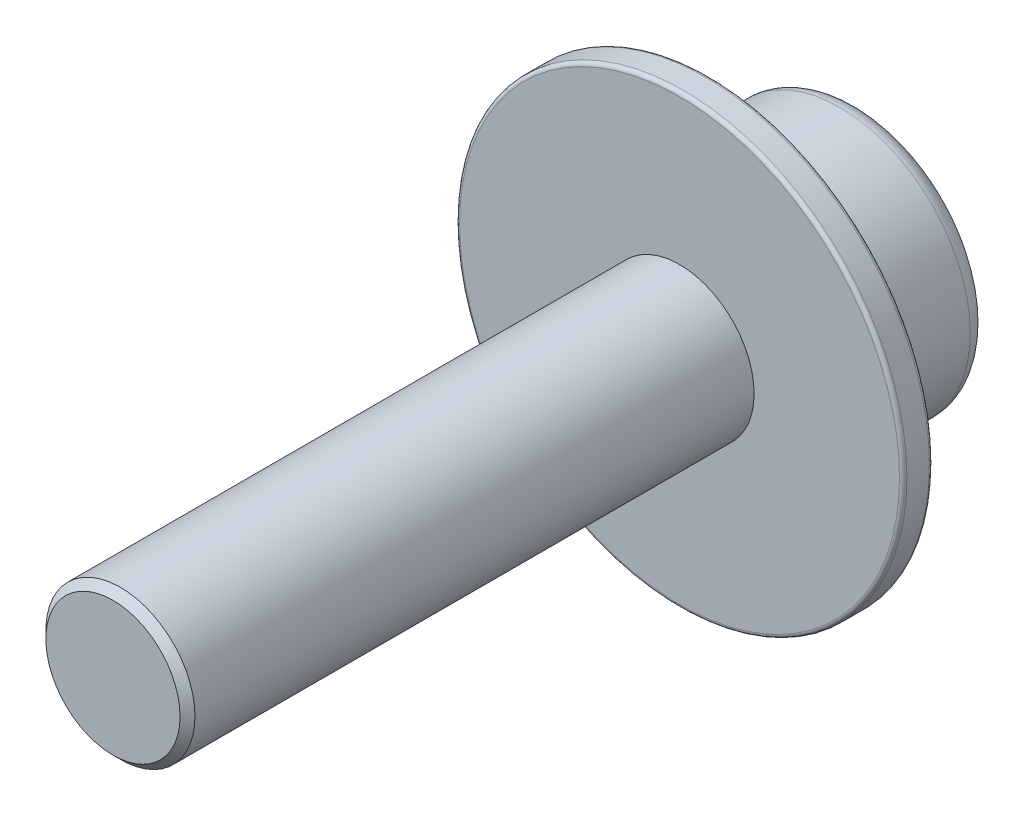
ISO-10303-21;
HEADER;
FILE_DESCRIPTION(('STEP AP214'),'2;1');
FILE_NAME('part.step','',(''),(''),'','','');
FILE_SCHEMA(('AUTOMOTIVE_DESIGN { 1 0 10303 214 1 1 1 1 }'));
ENDSEC;
DATA;
#1=APPLICATION_CONTEXT('core data for automotive mechanical design processes');
#2=APPLICATION_PROTOCOL_DEFINITION('international standard','automotive_design',2000,#1);
#3=PRODUCT_CONTEXT('',#1,'mechanical');
#4=PRODUCT('Part','Part','',(#3));
#5=PRODUCT_RELATED_PRODUCT_CATEGORY('part','',(#4));
#6=PRODUCT_DEFINITION_FORMATION('','',#4);
#7=PRODUCT_DEFINITION_CONTEXT('part definition',#1,'design');
#8=PRODUCT_DEFINITION('design','',#6,#7);
#9=PRODUCT_DEFINITION_SHAPE('','',#8);
#10=(LENGTH_UNIT() NAMED_UNIT(*) SI_UNIT(.MILLI.,.METRE.));
#11=(NAMED_UNIT(*) PLANE_ANGLE_UNIT() SI_UNIT($,.RADIAN.));
#12=(NAMED_UNIT(*) SI_UNIT($,.STERADIAN.) SOLID_ANGLE_UNIT());
#13=UNCERTAINTY_MEASURE_WITH_UNIT(LENGTH_MEASURE(1.E-05),#10,'distance_accuracy_value','');
#14=(GEOMETRIC_REPRESENTATION_CONTEXT(3) GLOBAL_UNCERTAINTY_ASSIGNED_CONTEXT((#13)) GLOBAL_UNIT_ASSIGNED_CONTEXT((#10,
#11,#12)) REPRESENTATION_CONTEXT('',''));
#15=CARTESIAN_POINT('',(0.,0.,0.));
#16=DIRECTION('',(0.,0.,1.));
#17=DIRECTION('',(1.,0.,0.));
#18=AXIS2_PLACEMENT_3D('',#15,#16,#17);
#19=CARTESIAN_POINT('',(0.,0.,4.));
#20=DIRECTION('',(0.,0.,-1.));
#21=DIRECTION('',(-1.,0.,0.));
#22=AXIS2_PLACEMENT_3D('',#19,#20,#21);
#23=CYLINDRICAL_SURFACE('',#22,3.5);
#24=CARTESIAN_POINT('',(0.,0.,3.5));
#25=DIRECTION('',(0.,0.,1.));
#26=DIRECTION('',(1.,0.,0.));
#27=AXIS2_PLACEMENT_3D('',#24,#25,#26);
#28=CIRCLE('',#27,3.5);
#29=CARTESIAN_POINT('',(3.5,0.,3.5));
#30=VERTEX_POINT('',#29);
#31=EDGE_CURVE('E180',#30,#30,#28,.F.);
#32=ORIENTED_EDGE('',*,*,#31,.T.);
#33=EDGE_LOOP('',(#32));
#34=FACE_BOUND('',#33,.T.);
#35=CARTESIAN_POINT('',(0.,0.,0.5));
#36=DIRECTION('',(0.,0.,1.));
#37=DIRECTION('',(1.,0.,0.));
#38=AXIS2_PLACEMENT_3D('',#35,#36,#37);
#39=CIRCLE('',#38,3.5);
#40=CARTESIAN_POINT('',(3.5,0.,0.5));
#41=VERTEX_POINT('',#40);
#42=EDGE_CURVE('E176',#41,#41,#39,.T.);
#43=ORIENTED_EDGE('',*,*,#42,.T.);
#44=EDGE_LOOP('',(#43));
#45=FACE_BOUND('',#44,.T.);
#46=ADVANCED_FACE('F41',(#34,#45),#23,.T.);
#47=CARTESIAN_POINT('',(0.,0.,0.));
#48=DIRECTION('',(0.,0.,1.));
#49=DIRECTION('',(1.,0.,0.));
#50=AXIS2_PLACEMENT_3D('',#47,#48,#49);
#51=PLANE('',#50);
#52=CARTESIAN_POINT('',(0.,0.,0.));
#53=DIRECTION('',(0.,0.,1.));
#54=DIRECTION('',(1.,0.,0.));
#55=AXIS2_PLACEMENT_3D('',#52,#53,#54);
#56=CIRCLE('',#55,3.);
#57=CARTESIAN_POINT('',(3.,0.,0.));
#58=VERTEX_POINT('',#57);
#59=EDGE_CURVE('E203',#58,#58,#56,.F.);
#60=ORIENTED_EDGE('',*,*,#59,.T.);
#61=EDGE_LOOP('',(#60));
#62=FACE_BOUND('',#61,.T.);
#63=DIRECTION('',(0.5,-0.866025403784439,0.));
#64=VECTOR('',#63,1.);
#65=CARTESIAN_POINT('',(1.94855715851499,1.125,0.));
#66=LINE('',#65,#64);
#67=CARTESIAN_POINT('',(2.59807621135332,0.,0.));
#68=VERTEX_POINT('',#67);
#69=CARTESIAN_POINT('',(1.29903810567666,2.25,0.));
#70=VERTEX_POINT('',#69);
#71=EDGE_CURVE('E196',#68,#70,#66,.F.);
#72=ORIENTED_EDGE('',*,*,#71,.T.);
#73=DIRECTION('',(1.,0.,0.));
#74=VECTOR('',#73,1.);
#75=CARTESIAN_POINT('',(0.,2.25,0.));
#76=LINE('',#75,#74);
#77=CARTESIAN_POINT('',(-1.29903810567666,2.25,0.));
#78=VERTEX_POINT('',#77);
#79=EDGE_CURVE('E199',#70,#78,#76,.F.);
#80=ORIENTED_EDGE('',*,*,#79,.T.);
#81=DIRECTION('',(0.5,0.866025403784439,0.));
#82=VECTOR('',#81,1.);
#83=CARTESIAN_POINT('',(-1.94855715851499,1.125,0.));
#84=LINE('',#83,#82);
#85=CARTESIAN_POINT('',(-2.59807621135332,0.,0.));
#86=VERTEX_POINT('',#85);
#87=EDGE_CURVE('E184',#78,#86,#84,.F.);
#88=ORIENTED_EDGE('',*,*,#87,.T.);
#89=DIRECTION('',(-0.5,0.866025403784439,0.));
#90=VECTOR('',#89,1.);
#91=CARTESIAN_POINT('',(-1.94855715851499,-1.125,0.));
#92=LINE('',#91,#90);
#93=CARTESIAN_POINT('',(-1.29903810567666,-2.25,0.));
#94=VERTEX_POINT('',#93);
#95=EDGE_CURVE('E187',#86,#94,#92,.F.);
#96=ORIENTED_EDGE('',*,*,#95,.T.);
#97=DIRECTION('',(-1.,0.,0.));
#98=VECTOR('',#97,1.);
#99=CARTESIAN_POINT('',(0.,-2.25,0.));
#100=LINE('',#99,#98);
#101=CARTESIAN_POINT('',(1.29903810567666,-2.25,0.));
#102=VERTEX_POINT('',#101);
#103=EDGE_CURVE('E190',#94,#102,#100,.F.);
#104=ORIENTED_EDGE('',*,*,#103,.T.);
#105=DIRECTION('',(-0.5,-0.866025403784439,0.));
#106=VECTOR('',#105,1.);
#107=CARTESIAN_POINT('',(1.94855715851499,-1.125,0.));
#108=LINE('',#107,#106);
#109=EDGE_CURVE('E193',#102,#68,#108,.F.);
#110=ORIENTED_EDGE('',*,*,#109,.T.);
#111=EDGE_LOOP('',(#72,#80,#88,#96,#104,#110));
#112=FACE_BOUND('',#111,.T.);
#113=ADVANCED_FACE('F301',(#62,#112),#51,.F.);
#114=CARTESIAN_POINT('',(-1.01036297108185,-1.75,2.5));
#115=DIRECTION('',(-0.866025403784439,-0.5,0.));
#116=DIRECTION('',(0.5,-0.866025403784439,0.));
#117=AXIS2_PLACEMENT_3D('',#114,#115,#116);
#118=PLANE('',#117);
#119=DIRECTION('',(0.,0.,-1.));
#120=VECTOR('',#119,1.);
#121=CARTESIAN_POINT('',(-1.01036297108185,-1.75,2.5));
#122=LINE('',#121,#120);
#123=CARTESIAN_POINT('',(-1.01036297108185,-1.75,2.5));
#124=VERTEX_POINT('',#123);
#125=CARTESIAN_POINT('',(-1.01036297108185,-1.75,0.5));
#126=VERTEX_POINT('',#125);
#127=EDGE_CURVE('E156',#124,#126,#122,.T.);
#128=ORIENTED_EDGE('',*,*,#127,.T.);
#129=DIRECTION('',(-0.5,0.866025403784439,0.));
#130=VECTOR('',#129,1.);
#131=CARTESIAN_POINT('',(-1.01036297108185,-1.75,0.5));
#132=LINE('',#131,#130);
#133=CARTESIAN_POINT('',(-2.02072594216369,0.,0.5));
#134=VERTEX_POINT('',#133);
#135=EDGE_CURVE('E57',#126,#134,#132,.T.);
#136=ORIENTED_EDGE('',*,*,#135,.T.);
#137=DIRECTION('',(0.,0.,-1.));
#138=VECTOR('',#137,1.);
#139=CARTESIAN_POINT('',(-2.02072594216369,0.,2.5));
#140=LINE('',#139,#138);
#141=CARTESIAN_POINT('',(-2.02072594216369,0.,2.5));
#142=VERTEX_POINT('',#141);
#143=EDGE_CURVE('E112',#142,#134,#140,.T.);
#144=ORIENTED_EDGE('',*,*,#143,.F.);
#145=DIRECTION('',(-0.5,0.866025403784439,0.));
#146=VECTOR('',#145,1.);
#147=CARTESIAN_POINT('',(-1.01036297108185,-1.75,2.5));
#148=LINE('',#147,#146);
#149=EDGE_CURVE('E116',#124,#142,#148,.T.);
#150=ORIENTED_EDGE('',*,*,#149,.F.);
#151=EDGE_LOOP('',(#128,#136,#144,#150));
#152=FACE_BOUND('',#151,.T.);
#153=ADVANCED_FACE('F114',(#152),#118,.F.);
#154=CARTESIAN_POINT('',(1.01036297108185,-1.75,2.5));
#155=DIRECTION('',(0.,-1.,0.));
#156=DIRECTION('',(0.,0.,-1.));
#157=AXIS2_PLACEMENT_3D('',#154,#155,#156);
#158=PLANE('',#157);
#159=DIRECTION('',(0.,0.,-1.));
#160=VECTOR('',#159,1.);
#161=CARTESIAN_POINT('',(1.01036297108185,-1.75,2.5));
#162=LINE('',#161,#160);
#163=CARTESIAN_POINT('',(1.01036297108185,-1.75,2.5));
#164=VERTEX_POINT('',#163);
#165=CARTESIAN_POINT('',(1.01036297108185,-1.75,0.5));
#166=VERTEX_POINT('',#165);
#167=EDGE_CURVE('E160',#164,#166,#162,.T.);
#168=ORIENTED_EDGE('',*,*,#167,.T.);
#169=DIRECTION('',(-1.,0.,0.));
#170=VECTOR('',#169,1.);
#171=CARTESIAN_POINT('',(1.01036297108185,-1.75,0.5));
#172=LINE('',#171,#170);
#173=EDGE_CURVE('E65',#166,#126,#172,.T.);
#174=ORIENTED_EDGE('',*,*,#173,.T.);
#175=ORIENTED_EDGE('',*,*,#127,.F.);
#176=DIRECTION('',(-1.,0.,0.));
#177=VECTOR('',#176,1.);
#178=CARTESIAN_POINT('',(1.01036297108185,-1.75,2.5));
#179=LINE('',#178,#177);
#180=EDGE_CURVE('E122',#164,#124,#179,.T.);
#181=ORIENTED_EDGE('',*,*,#180,.F.);
#182=EDGE_LOOP('',(#168,#174,#175,#181));
#183=FACE_BOUND('',#182,.T.);
#184=ADVANCED_FACE('F370',(#183),#158,.F.);
#185=CARTESIAN_POINT('',(2.02072594216369,0.,2.5));
#186=DIRECTION('',(0.866025403784439,-0.5,0.));
#187=DIRECTION('',(0.5,0.866025403784439,0.));
#188=AXIS2_PLACEMENT_3D('',#185,#186,#187);
#189=PLANE('',#188);
#190=DIRECTION('',(0.,0.,-1.));
#191=VECTOR('',#190,1.);
#192=CARTESIAN_POINT('',(2.02072594216369,0.,2.5));
#193=LINE('',#192,#191);
#194=CARTESIAN_POINT('',(2.02072594216369,0.,2.5));
#195=VERTEX_POINT('',#194);
#196=CARTESIAN_POINT('',(2.02072594216369,0.,0.5));
#197=VERTEX_POINT('',#196);
#198=EDGE_CURVE('E163',#195,#197,#193,.T.);
#199=ORIENTED_EDGE('',*,*,#198,.T.);
#200=DIRECTION('',(-0.5,-0.866025403784439,0.));
#201=VECTOR('',#200,1.);
#202=CARTESIAN_POINT('',(2.02072594216369,0.,0.5));
#203=LINE('',#202,#201);
#204=EDGE_CURVE('E214',#197,#166,#203,.T.);
#205=ORIENTED_EDGE('',*,*,#204,.T.);
#206=ORIENTED_EDGE('',*,*,#167,.F.);
#207=DIRECTION('',(-0.5,-0.866025403784439,0.));
#208=VECTOR('',#207,1.);
#209=CARTESIAN_POINT('',(2.02072594216369,0.,2.5));
#210=LINE('',#209,#208);
#211=EDGE_CURVE('E151',#195,#164,#210,.T.);
#212=ORIENTED_EDGE('',*,*,#211,.F.);
#213=EDGE_LOOP('',(#199,#205,#206,#212));
#214=FACE_BOUND('',#213,.T.);
#215=ADVANCED_FACE('F369',(#214),#189,.F.);
#216=CARTESIAN_POINT('',(1.01036297108185,1.75,2.5));
#217=DIRECTION('',(0.866025403784439,0.5,0.));
#218=DIRECTION('',(-0.5,0.866025403784439,0.));
#219=AXIS2_PLACEMENT_3D('',#216,#217,#218);
#220=PLANE('',#219);
#221=DIRECTION('',(0.,0.,-1.));
#222=VECTOR('',#221,1.);
#223=CARTESIAN_POINT('',(1.01036297108185,1.75,2.5));
#224=LINE('',#223,#222);
#225=CARTESIAN_POINT('',(1.01036297108185,1.75,2.5));
#226=VERTEX_POINT('',#225);
#227=CARTESIAN_POINT('',(1.01036297108185,1.75,0.5));
#228=VERTEX_POINT('',#227);
#229=EDGE_CURVE('E167',#226,#228,#224,.T.);
#230=ORIENTED_EDGE('',*,*,#229,.T.);
#231=DIRECTION('',(0.5,-0.866025403784439,0.));
#232=VECTOR('',#231,1.);
#233=CARTESIAN_POINT('',(1.01036297108185,1.75,0.5));
#234=LINE('',#233,#232);
#235=EDGE_CURVE('E211',#228,#197,#234,.T.);
#236=ORIENTED_EDGE('',*,*,#235,.T.);
#237=ORIENTED_EDGE('',*,*,#198,.F.);
#238=DIRECTION('',(0.5,-0.866025403784439,0.));
#239=VECTOR('',#238,1.);
#240=CARTESIAN_POINT('',(1.01036297108185,1.75,2.5));
#241=LINE('',#240,#239);
#242=EDGE_CURVE('E147',#226,#195,#241,.T.);
#243=ORIENTED_EDGE('',*,*,#242,.F.);
#244=EDGE_LOOP('',(#230,#236,#237,#243));
#245=FACE_BOUND('',#244,.T.);
#246=ADVANCED_FACE('F366',(#245),#220,.F.);
#247=CARTESIAN_POINT('',(-1.01036297108184,1.75,2.5));
#248=DIRECTION('',(0.,1.,0.));
#249=DIRECTION('',(0.,0.,1.));
#250=AXIS2_PLACEMENT_3D('',#247,#248,#249);
#251=PLANE('',#250);
#252=DIRECTION('',(0.,0.,-1.));
#253=VECTOR('',#252,1.);
#254=CARTESIAN_POINT('',(-1.01036297108184,1.75,2.5));
#255=LINE('',#254,#253);
#256=CARTESIAN_POINT('',(-1.01036297108184,1.75,2.5));
#257=VERTEX_POINT('',#256);
#258=CARTESIAN_POINT('',(-1.01036297108184,1.75,0.5));
#259=VERTEX_POINT('',#258);
#260=EDGE_CURVE('E121',#257,#259,#255,.T.);
#261=ORIENTED_EDGE('',*,*,#260,.T.);
#262=DIRECTION('',(1.,0.,0.));
#263=VECTOR('',#262,1.);
#264=CARTESIAN_POINT('',(-1.01036297108184,1.75,0.5));
#265=LINE('',#264,#263);
#266=EDGE_CURVE('E207',#259,#228,#265,.T.);
#267=ORIENTED_EDGE('',*,*,#266,.T.);
#268=ORIENTED_EDGE('',*,*,#229,.F.);
#269=DIRECTION('',(1.,0.,0.));
#270=VECTOR('',#269,1.);
#271=CARTESIAN_POINT('',(-1.01036297108184,1.75,2.5));
#272=LINE('',#271,#270);
#273=EDGE_CURVE('E132',#257,#226,#272,.T.);
#274=ORIENTED_EDGE('',*,*,#273,.F.);
#275=EDGE_LOOP('',(#261,#267,#268,#274));
#276=FACE_BOUND('',#275,.T.);
#277=ADVANCED_FACE('F362',(#276),#251,.F.);
#278=CARTESIAN_POINT('',(-2.02072594216369,0.,2.5));
#279=DIRECTION('',(-0.866025403784439,0.5,0.));
#280=DIRECTION('',(-0.5,-0.866025403784439,0.));
#281=AXIS2_PLACEMENT_3D('',#278,#279,#280);
#282=PLANE('',#281);
#283=ORIENTED_EDGE('',*,*,#143,.T.);
#284=DIRECTION('',(0.5,0.866025403784439,0.));
#285=VECTOR('',#284,1.);
#286=CARTESIAN_POINT('',(-2.02072594216369,0.,0.5));
#287=LINE('',#286,#285);
#288=EDGE_CURVE('E221',#134,#259,#287,.T.);
#289=ORIENTED_EDGE('',*,*,#288,.T.);
#290=ORIENTED_EDGE('',*,*,#260,.F.);
#291=DIRECTION('',(0.5,0.866025403784439,0.));
#292=VECTOR('',#291,1.);
#293=CARTESIAN_POINT('',(-2.02072594216369,0.,2.5));
#294=LINE('',#293,#292);
#295=EDGE_CURVE('E125',#142,#257,#294,.T.);
#296=ORIENTED_EDGE('',*,*,#295,.F.);
#297=EDGE_LOOP('',(#283,#289,#290,#296));
#298=FACE_BOUND('',#297,.T.);
#299=ADVANCED_FACE('F126',(#298),#282,.F.);
#300=CARTESIAN_POINT('',(0.,0.,2.5));
#301=DIRECTION('',(0.,0.,-1.));
#302=DIRECTION('',(-1.,0.,0.));
#303=AXIS2_PLACEMENT_3D('',#300,#301,#302);
#304=PLANE('',#303);
#305=ORIENTED_EDGE('',*,*,#149,.T.);
#306=ORIENTED_EDGE('',*,*,#295,.T.);
#307=ORIENTED_EDGE('',*,*,#273,.T.);
#308=ORIENTED_EDGE('',*,*,#242,.T.);
#309=ORIENTED_EDGE('',*,*,#211,.T.);
#310=ORIENTED_EDGE('',*,*,#180,.T.);
#311=EDGE_LOOP('',(#305,#306,#307,#308,#309,#310));
#312=FACE_BOUND('',#311,.T.);
#313=ADVANCED_FACE('F134',(#312),#304,.T.);
#314=CARTESIAN_POINT('',(0.,0.,3.5));
#315=DIRECTION('',(0.,0.,1.));
#316=DIRECTION('',(1.,0.,0.));
#317=AXIS2_PLACEMENT_3D('',#314,#315,#316);
#318=TOROIDAL_SURFACE('',#317,3.,0.5);
#319=ORIENTED_EDGE('',*,*,#31,.F.);
#320=EDGE_LOOP('',(#319));
#321=FACE_BOUND('',#320,.T.);
#322=CARTESIAN_POINT('',(0.,0.,4.));
#323=DIRECTION('',(0.,0.,1.));
#324=DIRECTION('',(1.,0.,0.));
#325=AXIS2_PLACEMENT_3D('',#322,#323,#324);
#326=CIRCLE('',#325,3.);
#327=CARTESIAN_POINT('',(3.,0.,4.));
#328=VERTEX_POINT('',#327);
#329=EDGE_CURVE('E159',#328,#328,#326,.T.);
#330=ORIENTED_EDGE('',*,*,#329,.F.);
#331=EDGE_LOOP('',(#330));
#332=FACE_BOUND('',#331,.T.);
#333=ADVANCED_FACE('F311',(#321,#332),#318,.T.);
#334=CARTESIAN_POINT('',(0.,0.,0.5));
#335=DIRECTION('',(0.,0.,1.));
#336=DIRECTION('',(1.,0.,0.));
#337=AXIS2_PLACEMENT_3D('',#334,#335,#336);
#338=TOROIDAL_SURFACE('',#337,3.,0.5);
#339=ORIENTED_EDGE('',*,*,#59,.F.);
#340=EDGE_LOOP('',(#339));
#341=FACE_BOUND('',#340,.T.);
#342=ORIENTED_EDGE('',*,*,#42,.F.);
#343=EDGE_LOOP('',(#342));
#344=FACE_BOUND('',#343,.T.);
#345=ADVANCED_FACE('F314',(#341,#344),#338,.T.);
#346=CARTESIAN_POINT('',(1.01036297108185,-2.25,0.5));
#347=DIRECTION('',(-1.,0.,0.));
#348=DIRECTION('',(0.,0.,1.));
#349=AXIS2_PLACEMENT_3D('',#346,#347,#348);
#350=CYLINDRICAL_SURFACE('',#349,0.5);
#351=CARTESIAN_POINT('',(1.29903810567666,-2.25,0.5));
#352=DIRECTION('',(-0.866025403784439,-0.5,0.));
#353=DIRECTION('',(0.5,-0.866025403784439,0.));
#354=AXIS2_PLACEMENT_3D('',#351,#352,#353);
#355=ELLIPSE('',#354,0.577350269189626,0.5);
#356=EDGE_CURVE('E142',#102,#166,#355,.F.);
#357=ORIENTED_EDGE('',*,*,#356,.F.);
#358=ORIENTED_EDGE('',*,*,#103,.F.);
#359=CARTESIAN_POINT('',(-1.29903810567666,-2.25,0.5));
#360=DIRECTION('',(-0.866025403784438,0.5,0.));
#361=DIRECTION('',(-0.5,-0.866025403784439,0.));
#362=AXIS2_PLACEMENT_3D('',#359,#360,#361);
#363=ELLIPSE('',#362,0.577350269189626,0.5);
#364=EDGE_CURVE('E138',#126,#94,#363,.T.);
#365=ORIENTED_EDGE('',*,*,#364,.F.);
#366=ORIENTED_EDGE('',*,*,#173,.F.);
#367=EDGE_LOOP('',(#357,#358,#365,#366));
#368=FACE_BOUND('',#367,.T.);
#369=ADVANCED_FACE('F318',(#368),#350,.T.);
#370=CARTESIAN_POINT('',(-1.44337567297406,-2.,0.5));
#371=DIRECTION('',(-0.5,0.866025403784439,0.));
#372=DIRECTION('',(-0.866025403784439,-0.5,0.));
#373=AXIS2_PLACEMENT_3D('',#370,#371,#372);
#374=CYLINDRICAL_SURFACE('',#373,0.5);
#375=ORIENTED_EDGE('',*,*,#364,.T.);
#376=ORIENTED_EDGE('',*,*,#95,.F.);
#377=CARTESIAN_POINT('',(-2.59807621135332,0.,0.5));
#378=DIRECTION('',(0.,1.,0.));
#379=DIRECTION('',(-1.,0.,0.));
#380=AXIS2_PLACEMENT_3D('',#377,#378,#379);
#381=ELLIPSE('',#380,0.577350269189626,0.5);
#382=EDGE_CURVE('E236',#134,#86,#381,.T.);
#383=ORIENTED_EDGE('',*,*,#382,.F.);
#384=ORIENTED_EDGE('',*,*,#135,.F.);
#385=EDGE_LOOP('',(#375,#376,#383,#384));
#386=FACE_BOUND('',#385,.T.);
#387=ADVANCED_FACE('F335',(#386),#374,.T.);
#388=CARTESIAN_POINT('',(2.45373864405591,-0.25,0.5));
#389=DIRECTION('',(-0.5,-0.866025403784439,0.));
#390=DIRECTION('',(0.866025403784439,-0.5,0.));
#391=AXIS2_PLACEMENT_3D('',#388,#389,#390);
#392=CYLINDRICAL_SURFACE('',#391,0.5);
#393=ORIENTED_EDGE('',*,*,#356,.T.);
#394=ORIENTED_EDGE('',*,*,#204,.F.);
#395=CARTESIAN_POINT('',(2.59807621135332,0.,0.5));
#396=DIRECTION('',(0.,-1.,0.));
#397=DIRECTION('',(1.,0.,0.));
#398=AXIS2_PLACEMENT_3D('',#395,#396,#397);
#399=ELLIPSE('',#398,0.577350269189626,0.5);
#400=EDGE_CURVE('E232',#68,#197,#399,.F.);
#401=ORIENTED_EDGE('',*,*,#400,.F.);
#402=ORIENTED_EDGE('',*,*,#109,.F.);
#403=EDGE_LOOP('',(#393,#394,#401,#402));
#404=FACE_BOUND('',#403,.T.);
#405=ADVANCED_FACE('F331',(#404),#392,.T.);
#406=CARTESIAN_POINT('',(-2.45373864405591,0.250000000000001,0.5));
#407=DIRECTION('',(0.5,0.866025403784439,0.));
#408=DIRECTION('',(-0.866025403784439,0.5,0.));
#409=AXIS2_PLACEMENT_3D('',#406,#407,#408);
#410=CYLINDRICAL_SURFACE('',#409,0.5);
#411=ORIENTED_EDGE('',*,*,#382,.T.);
#412=ORIENTED_EDGE('',*,*,#87,.F.);
#413=CARTESIAN_POINT('',(-1.29903810567666,2.25,0.5));
#414=DIRECTION('',(0.866025403784439,0.5,0.));
#415=DIRECTION('',(0.5,-0.866025403784439,0.));
#416=AXIS2_PLACEMENT_3D('',#413,#414,#415);
#417=ELLIPSE('',#416,0.577350269189626,0.5);
#418=EDGE_CURVE('E228',#259,#78,#417,.T.);
#419=ORIENTED_EDGE('',*,*,#418,.F.);
#420=ORIENTED_EDGE('',*,*,#288,.F.);
#421=EDGE_LOOP('',(#411,#412,#419,#420));
#422=FACE_BOUND('',#421,.T.);
#423=ADVANCED_FACE('F327',(#422),#410,.T.);
#424=CARTESIAN_POINT('',(1.44337567297406,2.,0.5));
#425=DIRECTION('',(0.5,-0.866025403784439,0.));
#426=DIRECTION('',(0.866025403784439,0.5,0.));
#427=AXIS2_PLACEMENT_3D('',#424,#425,#426);
#428=CYLINDRICAL_SURFACE('',#427,0.5);
#429=ORIENTED_EDGE('',*,*,#400,.T.);
#430=ORIENTED_EDGE('',*,*,#235,.F.);
#431=CARTESIAN_POINT('',(1.29903810567666,2.25,0.5));
#432=DIRECTION('',(0.866025403784439,-0.5,0.));
#433=DIRECTION('',(0.5,0.866025403784439,0.));
#434=AXIS2_PLACEMENT_3D('',#431,#432,#433);
#435=ELLIPSE('',#434,0.577350269189626,0.5);
#436=EDGE_CURVE('E225',#70,#228,#435,.F.);
#437=ORIENTED_EDGE('',*,*,#436,.F.);
#438=ORIENTED_EDGE('',*,*,#71,.F.);
#439=EDGE_LOOP('',(#429,#430,#437,#438));
#440=FACE_BOUND('',#439,.T.);
#441=ADVANCED_FACE('F323',(#440),#428,.T.);
#442=CARTESIAN_POINT('',(-1.01036297108184,2.25,0.5));
#443=DIRECTION('',(1.,0.,0.));
#444=DIRECTION('',(0.,0.,-1.));
#445=AXIS2_PLACEMENT_3D('',#442,#443,#444);
#446=CYLINDRICAL_SURFACE('',#445,0.5);
#447=ORIENTED_EDGE('',*,*,#418,.T.);
#448=ORIENTED_EDGE('',*,*,#79,.F.);
#449=ORIENTED_EDGE('',*,*,#436,.T.);
#450=ORIENTED_EDGE('',*,*,#266,.F.);
#451=EDGE_LOOP('',(#447,#448,#449,#450));
#452=FACE_BOUND('',#451,.T.);
#453=ADVANCED_FACE('F320',(#452),#446,.T.);
#454=CARTESIAN_POINT('',(0.,0.,4.8));
#455=DIRECTION('',(0.,0.,-1.));
#456=DIRECTION('',(-1.,0.,0.));
#457=AXIS2_PLACEMENT_3D('',#454,#455,#456);
#458=CYLINDRICAL_SURFACE('',#457,6.);
#459=CARTESIAN_POINT('',(0.,0.,4.7));
#460=DIRECTION('',(0.,0.,1.));
#461=DIRECTION('',(1.,0.,0.));
#462=AXIS2_PLACEMENT_3D('',#459,#460,#461);
#463=CIRCLE('',#462,6.);
#464=CARTESIAN_POINT('',(6.,0.,4.7));
#465=VERTEX_POINT('',#464);
#466=EDGE_CURVE('E50',#465,#465,#463,.F.);
#467=ORIENTED_EDGE('',*,*,#466,.T.);
#468=EDGE_LOOP('',(#467));
#469=FACE_BOUND('',#468,.T.);
#470=CARTESIAN_POINT('',(0.,0.,4.1));
#471=DIRECTION('',(0.,0.,1.));
#472=DIRECTION('',(1.,0.,0.));
#473=AXIS2_PLACEMENT_3D('',#470,#471,#472);
#474=CIRCLE('',#473,6.);
#475=CARTESIAN_POINT('',(6.,0.,4.1));
#476=VERTEX_POINT('',#475);
#477=EDGE_CURVE('E257',#476,#476,#474,.T.);
#478=ORIENTED_EDGE('',*,*,#477,.T.);
#479=EDGE_LOOP('',(#478));
#480=FACE_BOUND('',#479,.T.);
#481=ADVANCED_FACE('F264',(#469,#480),#458,.T.);
#482=CARTESIAN_POINT('',(0.,0.,4.8));
#483=DIRECTION('',(0.,0.,1.));
#484=DIRECTION('',(1.,0.,0.));
#485=AXIS2_PLACEMENT_3D('',#482,#483,#484);
#486=PLANE('',#485);
#487=CARTESIAN_POINT('',(0.,0.,4.8));
#488=DIRECTION('',(0.,0.,1.));
#489=DIRECTION('',(1.,0.,0.));
#490=AXIS2_PLACEMENT_3D('',#487,#488,#489);
#491=CIRCLE('',#490,5.9);
#492=CARTESIAN_POINT('',(5.9,0.,4.8));
#493=VERTEX_POINT('',#492);
#494=EDGE_CURVE('E250',#493,#493,#491,.T.);
#495=ORIENTED_EDGE('',*,*,#494,.T.);
#496=EDGE_LOOP('',(#495));
#497=FACE_BOUND('',#496,.T.);
#498=CARTESIAN_POINT('',(0.,0.,4.8));
#499=DIRECTION('',(0.,0.,1.));
#500=DIRECTION('',(1.,0.,0.));
#501=AXIS2_PLACEMENT_3D('',#498,#499,#500);
#502=CIRCLE('',#501,2.);
#503=CARTESIAN_POINT('',(2.,0.,4.8));
#504=VERTEX_POINT('',#503);
#505=EDGE_CURVE('E229',#504,#504,#502,.T.);
#506=ORIENTED_EDGE('',*,*,#505,.F.);
#507=EDGE_LOOP('',(#506));
#508=FACE_BOUND('',#507,.T.);
#509=ADVANCED_FACE('F273',(#497,#508),#486,.T.);
#510=CARTESIAN_POINT('',(0.,0.,4.));
#511=DIRECTION('',(0.,0.,1.));
#512=DIRECTION('',(1.,0.,0.));
#513=AXIS2_PLACEMENT_3D('',#510,#511,#512);
#514=PLANE('',#513);
#515=CARTESIAN_POINT('',(0.,0.,4.));
#516=DIRECTION('',(0.,0.,1.));
#517=DIRECTION('',(1.,0.,0.));
#518=AXIS2_PLACEMENT_3D('',#515,#516,#517);
#519=CIRCLE('',#518,5.9);
#520=CARTESIAN_POINT('',(5.9,0.,4.));
#521=VERTEX_POINT('',#520);
#522=EDGE_CURVE('E11',#521,#521,#519,.F.);
#523=ORIENTED_EDGE('',*,*,#522,.T.);
#524=EDGE_LOOP('',(#523));
#525=FACE_BOUND('',#524,.T.);
#526=ORIENTED_EDGE('',*,*,#329,.T.);
#527=EDGE_LOOP('',(#526));
#528=FACE_BOUND('',#527,.T.);
#529=ADVANCED_FACE('F276',(#525,#528),#514,.F.);
#530=CARTESIAN_POINT('',(0.,0.,20.));
#531=DIRECTION('',(0.,0.,1.));
#532=DIRECTION('',(1.,0.,0.));
#533=AXIS2_PLACEMENT_3D('',#530,#531,#532);
#534=PLANE('',#533);
#535=CARTESIAN_POINT('',(0.,0.,20.));
#536=DIRECTION('',(0.,0.,1.));
#537=DIRECTION('',(1.,0.,0.));
#538=AXIS2_PLACEMENT_3D('',#535,#536,#537);
#539=CIRCLE('',#538,1.8);
#540=CARTESIAN_POINT('',(1.8,0.,20.));
#541=VERTEX_POINT('',#540);
#542=EDGE_CURVE('E224',#541,#541,#539,.T.);
#543=ORIENTED_EDGE('',*,*,#542,.T.);
#544=EDGE_LOOP('',(#543));
#545=FACE_BOUND('',#544,.T.);
#546=ADVANCED_FACE('F288',(#545),#534,.T.);
#547=CARTESIAN_POINT('',(0.,0.,20.));
#548=DIRECTION('',(0.,0.,-1.));
#549=DIRECTION('',(-1.,0.,0.));
#550=AXIS2_PLACEMENT_3D('',#547,#548,#549);
#551=CONICAL_SURFACE('',#550,1.8,0.785398163397444);
#552=CARTESIAN_POINT('',(0.,0.,19.8));
#553=DIRECTION('',(0.,0.,1.));
#554=DIRECTION('',(1.,0.,0.));
#555=AXIS2_PLACEMENT_3D('',#552,#553,#554);
#556=CIRCLE('',#555,2.);
#557=CARTESIAN_POINT('',(2.,0.,19.8));
#558=VERTEX_POINT('',#557);
#559=EDGE_CURVE('E246',#558,#558,#556,.F.);
#560=ORIENTED_EDGE('',*,*,#559,.F.);
#561=EDGE_LOOP('',(#560));
#562=FACE_BOUND('',#561,.T.);
#563=ORIENTED_EDGE('',*,*,#542,.F.);
#564=EDGE_LOOP('',(#563));
#565=FACE_BOUND('',#564,.T.);
#566=ADVANCED_FACE('F282',(#562,#565),#551,.T.);
#567=CARTESIAN_POINT('',(0.,0.,20.));
#568=DIRECTION('',(0.,0.,-1.));
#569=DIRECTION('',(-1.,0.,0.));
#570=AXIS2_PLACEMENT_3D('',#567,#568,#569);
#571=CYLINDRICAL_SURFACE('',#570,2.);
#572=ORIENTED_EDGE('',*,*,#505,.T.);
#573=EDGE_LOOP('',(#572));
#574=FACE_BOUND('',#573,.T.);
#575=ORIENTED_EDGE('',*,*,#559,.T.);
#576=EDGE_LOOP('',(#575));
#577=FACE_BOUND('',#576,.T.);
#578=ADVANCED_FACE('F270',(#574,#577),#571,.T.);
#579=CARTESIAN_POINT('',(0.,0.,4.7));
#580=DIRECTION('',(0.,0.,1.));
#581=DIRECTION('',(1.,0.,0.));
#582=AXIS2_PLACEMENT_3D('',#579,#580,#581);
#583=TOROIDAL_SURFACE('',#582,5.9,0.1);
#584=ORIENTED_EDGE('',*,*,#466,.F.);
#585=EDGE_LOOP('',(#584));
#586=FACE_BOUND('',#585,.T.);
#587=ORIENTED_EDGE('',*,*,#494,.F.);
#588=EDGE_LOOP('',(#587));
#589=FACE_BOUND('',#588,.T.);
#590=ADVANCED_FACE('F267',(#586,#589),#583,.T.);
#591=CARTESIAN_POINT('',(0.,0.,4.1));
#592=DIRECTION('',(0.,0.,1.));
#593=DIRECTION('',(1.,0.,0.));
#594=AXIS2_PLACEMENT_3D('',#591,#592,#593);
#595=TOROIDAL_SURFACE('',#594,5.9,0.1);
#596=ORIENTED_EDGE('',*,*,#522,.F.);
#597=EDGE_LOOP('',(#596));
#598=FACE_BOUND('',#597,.T.);
#599=ORIENTED_EDGE('',*,*,#477,.F.);
#600=EDGE_LOOP('',(#599));
#601=FACE_BOUND('',#600,.T.);
#602=ADVANCED_FACE('F43',(#598,#601),#595,.T.);
#603=CLOSED_SHELL('',(#46,#113,#153,#184,#215,#246,#277,#299,#313,#333,#345,#369,#387,#405,#423,
#441,#453,#481,#509,#529,#546,#566,#578,#590,#602));
#604=MANIFOLD_SOLID_BREP('B2',#603);
#605=ADVANCED_BREP_SHAPE_REPRESENTATION('',(#18,#604),#14);
#606=SHAPE_DEFINITION_REPRESENTATION(#9,#605);
ENDSEC;
END-ISO-10303-21;
